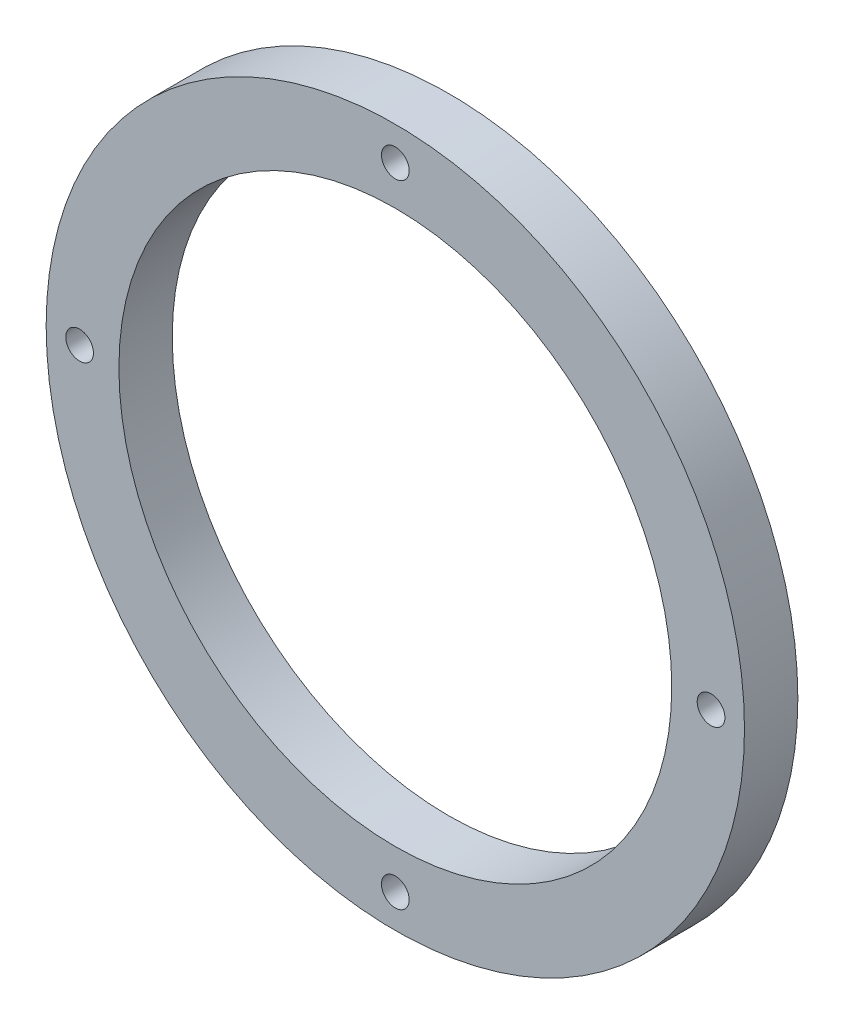
ISO-10303-21;
HEADER;
FILE_DESCRIPTION(('STEP AP214'),'2;1');
FILE_NAME('part.step','',(''),(''),'','','');
FILE_SCHEMA(('AUTOMOTIVE_DESIGN { 1 0 10303 214 1 1 1 1 }'));
ENDSEC;
DATA;
#1=APPLICATION_CONTEXT('core data for automotive mechanical design processes');
#2=APPLICATION_PROTOCOL_DEFINITION('international standard','automotive_design',2000,#1);
#3=PRODUCT_CONTEXT('',#1,'mechanical');
#4=PRODUCT('Part','Part','',(#3));
#5=PRODUCT_RELATED_PRODUCT_CATEGORY('part','',(#4));
#6=PRODUCT_DEFINITION_FORMATION('','',#4);
#7=PRODUCT_DEFINITION_CONTEXT('part definition',#1,'design');
#8=PRODUCT_DEFINITION('design','',#6,#7);
#9=PRODUCT_DEFINITION_SHAPE('','',#8);
#10=(LENGTH_UNIT() NAMED_UNIT(*) SI_UNIT(.MILLI.,.METRE.));
#11=(NAMED_UNIT(*) PLANE_ANGLE_UNIT() SI_UNIT($,.RADIAN.));
#12=(NAMED_UNIT(*) SI_UNIT($,.STERADIAN.) SOLID_ANGLE_UNIT());
#13=UNCERTAINTY_MEASURE_WITH_UNIT(LENGTH_MEASURE(1.E-05),#10,'distance_accuracy_value','');
#14=(GEOMETRIC_REPRESENTATION_CONTEXT(3) GLOBAL_UNCERTAINTY_ASSIGNED_CONTEXT((#13)) GLOBAL_UNIT_ASSIGNED_CONTEXT((#10,
#11,#12)) REPRESENTATION_CONTEXT('',''));
#15=CARTESIAN_POINT('',(0.,0.,0.));
#16=DIRECTION('',(0.,0.,1.));
#17=DIRECTION('',(1.,0.,0.));
#18=AXIS2_PLACEMENT_3D('',#15,#16,#17);
#19=CARTESIAN_POINT('',(0.,0.,9.1694));
#20=DIRECTION('',(0.,0.,1.));
#21=DIRECTION('',(1.,0.,0.));
#22=AXIS2_PLACEMENT_3D('',#19,#20,#21);
#23=PLANE('',#22);
#24=CARTESIAN_POINT('',(0.,-54.25,9.1694));
#25=DIRECTION('',(0.,0.,1.));
#26=DIRECTION('',(1.,0.,0.));
#27=AXIS2_PLACEMENT_3D('',#24,#25,#26);
#28=CIRCLE('',#27,2.38125);
#29=CARTESIAN_POINT('',(2.38125000000002,-54.25,9.1694));
#30=VERTEX_POINT('',#29);
#31=EDGE_CURVE('E72',#30,#30,#28,.T.);
#32=ORIENTED_EDGE('',*,*,#31,.F.);
#33=EDGE_LOOP('',(#32));
#34=FACE_BOUND('',#33,.T.);
#35=CARTESIAN_POINT('',(0.,54.25,9.1694));
#36=DIRECTION('',(0.,0.,1.));
#37=DIRECTION('',(1.,0.,0.));
#38=AXIS2_PLACEMENT_3D('',#35,#36,#37);
#39=CIRCLE('',#38,2.38125);
#40=CARTESIAN_POINT('',(2.38125,54.25,9.1694));
#41=VERTEX_POINT('',#40);
#42=EDGE_CURVE('E56',#41,#41,#39,.T.);
#43=ORIENTED_EDGE('',*,*,#42,.F.);
#44=EDGE_LOOP('',(#43));
#45=FACE_BOUND('',#44,.T.);
#46=CARTESIAN_POINT('',(0.,0.,9.1694));
#47=DIRECTION('',(0.,0.,1.));
#48=DIRECTION('',(1.,0.,0.));
#49=AXIS2_PLACEMENT_3D('',#46,#47,#48);
#50=CIRCLE('',#49,60.);
#51=CARTESIAN_POINT('',(60.,0.,9.1694));
#52=VERTEX_POINT('',#51);
#53=EDGE_CURVE('E10',#52,#52,#50,.T.);
#54=ORIENTED_EDGE('',*,*,#53,.T.);
#55=EDGE_LOOP('',(#54));
#56=FACE_BOUND('',#55,.T.);
#57=CARTESIAN_POINT('',(0.,0.,9.1694));
#58=DIRECTION('',(0.,0.,1.));
#59=DIRECTION('',(1.,0.,0.));
#60=AXIS2_PLACEMENT_3D('',#57,#58,#59);
#61=CIRCLE('',#60,47.5);
#62=CARTESIAN_POINT('',(47.5,0.,9.1694));
#63=VERTEX_POINT('',#62);
#64=EDGE_CURVE('E50',#63,#63,#61,.T.);
#65=ORIENTED_EDGE('',*,*,#64,.F.);
#66=EDGE_LOOP('',(#65));
#67=FACE_BOUND('',#66,.T.);
#68=CARTESIAN_POINT('',(54.25,0.,9.1694));
#69=DIRECTION('',(0.,0.,1.));
#70=DIRECTION('',(1.,0.,0.));
#71=AXIS2_PLACEMENT_3D('',#68,#69,#70);
#72=CIRCLE('',#71,2.38125);
#73=CARTESIAN_POINT('',(56.63125,0.,9.1694));
#74=VERTEX_POINT('',#73);
#75=EDGE_CURVE('E64',#74,#74,#72,.T.);
#76=ORIENTED_EDGE('',*,*,#75,.F.);
#77=EDGE_LOOP('',(#76));
#78=FACE_BOUND('',#77,.T.);
#79=CARTESIAN_POINT('',(-54.25,0.,9.1694));
#80=DIRECTION('',(0.,0.,1.));
#81=DIRECTION('',(1.,0.,0.));
#82=AXIS2_PLACEMENT_3D('',#79,#80,#81);
#83=CIRCLE('',#82,2.38125);
#84=CARTESIAN_POINT('',(-51.86875,0.,9.1694));
#85=VERTEX_POINT('',#84);
#86=EDGE_CURVE('E80',#85,#85,#83,.T.);
#87=ORIENTED_EDGE('',*,*,#86,.F.);
#88=EDGE_LOOP('',(#87));
#89=FACE_BOUND('',#88,.T.);
#90=ADVANCED_FACE('F37',(#34,#45,#56,#67,#78,#89),#23,.T.);
#91=CARTESIAN_POINT('',(0.,0.,0.));
#92=DIRECTION('',(0.,0.,1.));
#93=DIRECTION('',(1.,0.,0.));
#94=AXIS2_PLACEMENT_3D('',#91,#92,#93);
#95=PLANE('',#94);
#96=CARTESIAN_POINT('',(0.,0.,0.));
#97=DIRECTION('',(0.,0.,1.));
#98=DIRECTION('',(1.,0.,0.));
#99=AXIS2_PLACEMENT_3D('',#96,#97,#98);
#100=CIRCLE('',#99,60.);
#101=CARTESIAN_POINT('',(60.,0.,0.));
#102=VERTEX_POINT('',#101);
#103=EDGE_CURVE('E41',#102,#102,#100,.T.);
#104=ORIENTED_EDGE('',*,*,#103,.F.);
#105=EDGE_LOOP('',(#104));
#106=FACE_BOUND('',#105,.T.);
#107=CARTESIAN_POINT('',(0.,0.,0.));
#108=DIRECTION('',(0.,0.,1.));
#109=DIRECTION('',(1.,0.,0.));
#110=AXIS2_PLACEMENT_3D('',#107,#108,#109);
#111=CIRCLE('',#110,47.5);
#112=CARTESIAN_POINT('',(47.5,0.,0.));
#113=VERTEX_POINT('',#112);
#114=EDGE_CURVE('E52',#113,#113,#111,.T.);
#115=ORIENTED_EDGE('',*,*,#114,.T.);
#116=EDGE_LOOP('',(#115));
#117=FACE_BOUND('',#116,.T.);
#118=CARTESIAN_POINT('',(0.,54.25,0.));
#119=DIRECTION('',(0.,0.,1.));
#120=DIRECTION('',(1.,0.,0.));
#121=AXIS2_PLACEMENT_3D('',#118,#119,#120);
#122=CIRCLE('',#121,2.38125);
#123=CARTESIAN_POINT('',(2.38125,54.25,0.));
#124=VERTEX_POINT('',#123);
#125=EDGE_CURVE('E60',#124,#124,#122,.T.);
#126=ORIENTED_EDGE('',*,*,#125,.T.);
#127=EDGE_LOOP('',(#126));
#128=FACE_BOUND('',#127,.T.);
#129=CARTESIAN_POINT('',(54.25,0.,0.));
#130=DIRECTION('',(0.,0.,1.));
#131=DIRECTION('',(1.,0.,0.));
#132=AXIS2_PLACEMENT_3D('',#129,#130,#131);
#133=CIRCLE('',#132,2.38125);
#134=CARTESIAN_POINT('',(56.63125,0.,0.));
#135=VERTEX_POINT('',#134);
#136=EDGE_CURVE('E68',#135,#135,#133,.T.);
#137=ORIENTED_EDGE('',*,*,#136,.T.);
#138=EDGE_LOOP('',(#137));
#139=FACE_BOUND('',#138,.T.);
#140=CARTESIAN_POINT('',(0.,-54.25,0.));
#141=DIRECTION('',(0.,0.,1.));
#142=DIRECTION('',(1.,0.,0.));
#143=AXIS2_PLACEMENT_3D('',#140,#141,#142);
#144=CIRCLE('',#143,2.38125);
#145=CARTESIAN_POINT('',(2.38125000000002,-54.25,0.));
#146=VERTEX_POINT('',#145);
#147=EDGE_CURVE('E76',#146,#146,#144,.T.);
#148=ORIENTED_EDGE('',*,*,#147,.T.);
#149=EDGE_LOOP('',(#148));
#150=FACE_BOUND('',#149,.T.);
#151=CARTESIAN_POINT('',(-54.25,0.,0.));
#152=DIRECTION('',(0.,0.,1.));
#153=DIRECTION('',(1.,0.,0.));
#154=AXIS2_PLACEMENT_3D('',#151,#152,#153);
#155=CIRCLE('',#154,2.38125);
#156=CARTESIAN_POINT('',(-51.86875,0.,0.));
#157=VERTEX_POINT('',#156);
#158=EDGE_CURVE('E84',#157,#157,#155,.T.);
#159=ORIENTED_EDGE('',*,*,#158,.T.);
#160=EDGE_LOOP('',(#159));
#161=FACE_BOUND('',#160,.T.);
#162=ADVANCED_FACE('F96',(#106,#117,#128,#139,#150,#161),#95,.F.);
#163=CARTESIAN_POINT('',(0.,0.,9.1694));
#164=DIRECTION('',(0.,0.,-1.));
#165=DIRECTION('',(-1.,0.,0.));
#166=AXIS2_PLACEMENT_3D('',#163,#164,#165);
#167=CYLINDRICAL_SURFACE('',#166,60.);
#168=ORIENTED_EDGE('',*,*,#53,.F.);
#169=EDGE_LOOP('',(#168));
#170=FACE_BOUND('',#169,.T.);
#171=ORIENTED_EDGE('',*,*,#103,.T.);
#172=EDGE_LOOP('',(#171));
#173=FACE_BOUND('',#172,.T.);
#174=ADVANCED_FACE('F39',(#170,#173),#167,.T.);
#175=CARTESIAN_POINT('',(0.,0.,9.1694));
#176=DIRECTION('',(0.,0.,-1.));
#177=DIRECTION('',(-1.,0.,0.));
#178=AXIS2_PLACEMENT_3D('',#175,#176,#177);
#179=CYLINDRICAL_SURFACE('',#178,47.5);
#180=ORIENTED_EDGE('',*,*,#64,.T.);
#181=EDGE_LOOP('',(#180));
#182=FACE_BOUND('',#181,.T.);
#183=ORIENTED_EDGE('',*,*,#114,.F.);
#184=EDGE_LOOP('',(#183));
#185=FACE_BOUND('',#184,.T.);
#186=ADVANCED_FACE('F106',(#182,#185),#179,.F.);
#187=CARTESIAN_POINT('',(0.,54.25,9.1694));
#188=DIRECTION('',(0.,0.,-1.));
#189=DIRECTION('',(-1.,0.,0.));
#190=AXIS2_PLACEMENT_3D('',#187,#188,#189);
#191=CYLINDRICAL_SURFACE('',#190,2.38125);
#192=ORIENTED_EDGE('',*,*,#42,.T.);
#193=EDGE_LOOP('',(#192));
#194=FACE_BOUND('',#193,.T.);
#195=ORIENTED_EDGE('',*,*,#125,.F.);
#196=EDGE_LOOP('',(#195));
#197=FACE_BOUND('',#196,.T.);
#198=ADVANCED_FACE('F109',(#194,#197),#191,.F.);
#199=CARTESIAN_POINT('',(54.25,0.,9.1694));
#200=DIRECTION('',(0.,0.,-1.));
#201=DIRECTION('',(-1.,0.,0.));
#202=AXIS2_PLACEMENT_3D('',#199,#200,#201);
#203=CYLINDRICAL_SURFACE('',#202,2.38125);
#204=ORIENTED_EDGE('',*,*,#75,.T.);
#205=EDGE_LOOP('',(#204));
#206=FACE_BOUND('',#205,.T.);
#207=ORIENTED_EDGE('',*,*,#136,.F.);
#208=EDGE_LOOP('',(#207));
#209=FACE_BOUND('',#208,.T.);
#210=ADVANCED_FACE('F113',(#206,#209),#203,.F.);
#211=CARTESIAN_POINT('',(0.,-54.25,9.1694));
#212=DIRECTION('',(0.,0.,-1.));
#213=DIRECTION('',(-1.,0.,0.));
#214=AXIS2_PLACEMENT_3D('',#211,#212,#213);
#215=CYLINDRICAL_SURFACE('',#214,2.38125);
#216=ORIENTED_EDGE('',*,*,#31,.T.);
#217=EDGE_LOOP('',(#216));
#218=FACE_BOUND('',#217,.T.);
#219=ORIENTED_EDGE('',*,*,#147,.F.);
#220=EDGE_LOOP('',(#219));
#221=FACE_BOUND('',#220,.T.);
#222=ADVANCED_FACE('F117',(#218,#221),#215,.F.);
#223=CARTESIAN_POINT('',(-54.25,0.,9.1694));
#224=DIRECTION('',(0.,0.,-1.));
#225=DIRECTION('',(-1.,0.,0.));
#226=AXIS2_PLACEMENT_3D('',#223,#224,#225);
#227=CYLINDRICAL_SURFACE('',#226,2.38125);
#228=ORIENTED_EDGE('',*,*,#86,.T.);
#229=EDGE_LOOP('',(#228));
#230=FACE_BOUND('',#229,.T.);
#231=ORIENTED_EDGE('',*,*,#158,.F.);
#232=EDGE_LOOP('',(#231));
#233=FACE_BOUND('',#232,.T.);
#234=ADVANCED_FACE('F92',(#230,#233),#227,.F.);
#235=CLOSED_SHELL('',(#90,#162,#174,#186,#198,#210,#222,#234));
#236=MANIFOLD_SOLID_BREP('B2',#235);
#237=ADVANCED_BREP_SHAPE_REPRESENTATION('',(#18,#236),#14);
#238=SHAPE_DEFINITION_REPRESENTATION(#9,#237);
ENDSEC;
END-ISO-10303-21;
